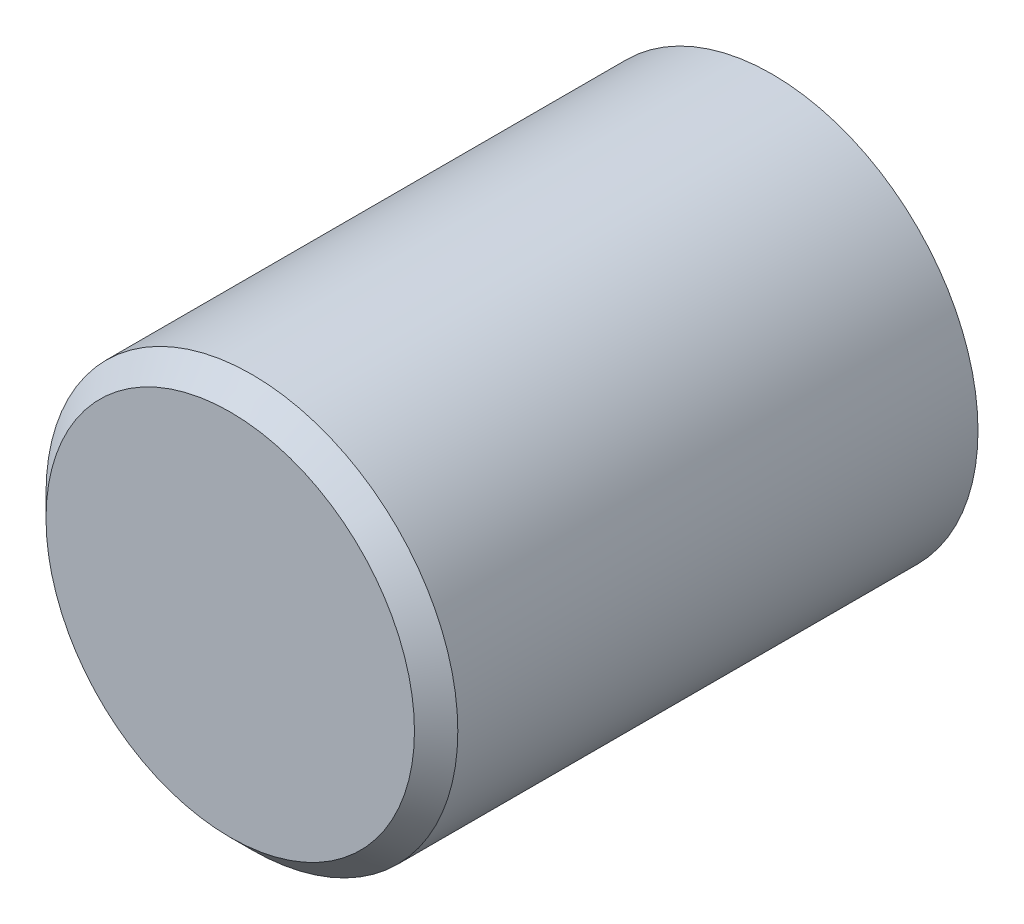
ISO-10303-21;
HEADER;
FILE_DESCRIPTION(('STEP AP214'),'2;1');
FILE_NAME('part.step','',(''),(''),'','','');
FILE_SCHEMA(('AUTOMOTIVE_DESIGN { 1 0 10303 214 1 1 1 1 }'));
ENDSEC;
DATA;
#1=APPLICATION_CONTEXT('core data for automotive mechanical design processes');
#2=APPLICATION_PROTOCOL_DEFINITION('international standard','automotive_design',2000,#1);
#3=PRODUCT_CONTEXT('',#1,'mechanical');
#4=PRODUCT('Part','Part','',(#3));
#5=PRODUCT_RELATED_PRODUCT_CATEGORY('part','',(#4));
#6=PRODUCT_DEFINITION_FORMATION('','',#4);
#7=PRODUCT_DEFINITION_CONTEXT('part definition',#1,'design');
#8=PRODUCT_DEFINITION('design','',#6,#7);
#9=PRODUCT_DEFINITION_SHAPE('','',#8);
#10=(LENGTH_UNIT() NAMED_UNIT(*) SI_UNIT(.MILLI.,.METRE.));
#11=(NAMED_UNIT(*) PLANE_ANGLE_UNIT() SI_UNIT($,.RADIAN.));
#12=(NAMED_UNIT(*) SI_UNIT($,.STERADIAN.) SOLID_ANGLE_UNIT());
#13=UNCERTAINTY_MEASURE_WITH_UNIT(LENGTH_MEASURE(1.E-05),#10,'distance_accuracy_value','');
#14=(GEOMETRIC_REPRESENTATION_CONTEXT(3) GLOBAL_UNCERTAINTY_ASSIGNED_CONTEXT((#13)) GLOBAL_UNIT_ASSIGNED_CONTEXT((#10,
#11,#12)) REPRESENTATION_CONTEXT('',''));
#15=CARTESIAN_POINT('',(0.,0.,0.));
#16=DIRECTION('',(0.,0.,1.));
#17=DIRECTION('',(1.,0.,0.));
#18=AXIS2_PLACEMENT_3D('',#15,#16,#17);
#19=CARTESIAN_POINT('',(0.,0.,-50.));
#20=DIRECTION('',(0.,0.,1.));
#21=DIRECTION('',(1.,0.,0.));
#22=AXIS2_PLACEMENT_3D('',#19,#20,#21);
#23=CYLINDRICAL_SURFACE('',#22,19.);
#24=CARTESIAN_POINT('',(0.,0.,-2.00000000000002));
#25=DIRECTION('',(0.,0.,1.));
#26=DIRECTION('',(1.,0.,0.));
#27=AXIS2_PLACEMENT_3D('',#24,#25,#26);
#28=CIRCLE('',#27,19.);
#29=CARTESIAN_POINT('',(19.,0.,-2.00000000000002));
#30=VERTEX_POINT('',#29);
#31=EDGE_CURVE('E10',#30,#30,#28,.F.);
#32=ORIENTED_EDGE('',*,*,#31,.T.);
#33=EDGE_LOOP('',(#32));
#34=FACE_BOUND('',#33,.T.);
#35=CARTESIAN_POINT('',(0.,0.,-50.));
#36=DIRECTION('',(0.,0.,1.));
#37=DIRECTION('',(1.,0.,0.));
#38=AXIS2_PLACEMENT_3D('',#35,#36,#37);
#39=CIRCLE('',#38,19.);
#40=CARTESIAN_POINT('',(19.,0.,-50.));
#41=VERTEX_POINT('',#40);
#42=EDGE_CURVE('E42',#41,#41,#39,.T.);
#43=ORIENTED_EDGE('',*,*,#42,.T.);
#44=EDGE_LOOP('',(#43));
#45=FACE_BOUND('',#44,.T.);
#46=ADVANCED_FACE('F31',(#34,#45),#23,.T.);
#47=CARTESIAN_POINT('',(0.,0.,-50.));
#48=DIRECTION('',(0.,0.,1.));
#49=DIRECTION('',(1.,0.,0.));
#50=AXIS2_PLACEMENT_3D('',#47,#48,#49);
#51=PLANE('',#50);
#52=CARTESIAN_POINT('',(0.,0.,-50.));
#53=DIRECTION('',(0.,0.,-1.));
#54=DIRECTION('',(-1.,0.,0.));
#55=AXIS2_PLACEMENT_3D('',#52,#53,#54);
#56=CIRCLE('',#55,8.);
#57=CARTESIAN_POINT('',(-8.,0.,-50.));
#58=VERTEX_POINT('',#57);
#59=EDGE_CURVE('E49',#58,#58,#56,.T.);
#60=ORIENTED_EDGE('',*,*,#59,.F.);
#61=EDGE_LOOP('',(#60));
#62=FACE_BOUND('',#61,.T.);
#63=ORIENTED_EDGE('',*,*,#42,.F.);
#64=EDGE_LOOP('',(#63));
#65=FACE_BOUND('',#64,.T.);
#66=ADVANCED_FACE('F63',(#62,#65),#51,.F.);
#67=CARTESIAN_POINT('',(0.,0.,0.));
#68=DIRECTION('',(0.,0.,1.));
#69=DIRECTION('',(1.,0.,0.));
#70=AXIS2_PLACEMENT_3D('',#67,#68,#69);
#71=PLANE('',#70);
#72=CARTESIAN_POINT('',(0.,0.,0.));
#73=DIRECTION('',(0.,0.,1.));
#74=DIRECTION('',(1.,0.,0.));
#75=AXIS2_PLACEMENT_3D('',#72,#73,#74);
#76=CIRCLE('',#75,17.);
#77=CARTESIAN_POINT('',(17.,0.,0.));
#78=VERTEX_POINT('',#77);
#79=EDGE_CURVE('E38',#78,#78,#76,.T.);
#80=ORIENTED_EDGE('',*,*,#79,.T.);
#81=EDGE_LOOP('',(#80));
#82=FACE_BOUND('',#81,.T.);
#83=ADVANCED_FACE('F66',(#82),#71,.T.);
#84=CARTESIAN_POINT('',(0.,0.,0.));
#85=DIRECTION('',(0.,0.,-1.));
#86=DIRECTION('',(-1.,0.,0.));
#87=AXIS2_PLACEMENT_3D('',#84,#85,#86);
#88=CONICAL_SURFACE('',#87,17.,0.785398163397447);
#89=ORIENTED_EDGE('',*,*,#31,.F.);
#90=EDGE_LOOP('',(#89));
#91=FACE_BOUND('',#90,.T.);
#92=ORIENTED_EDGE('',*,*,#79,.F.);
#93=EDGE_LOOP('',(#92));
#94=FACE_BOUND('',#93,.T.);
#95=ADVANCED_FACE('F33',(#91,#94),#88,.T.);
#96=CARTESIAN_POINT('',(0.,0.,-20.));
#97=DIRECTION('',(0.,0.,-1.));
#98=DIRECTION('',(-1.,0.,0.));
#99=AXIS2_PLACEMENT_3D('',#96,#97,#98);
#100=CYLINDRICAL_SURFACE('',#99,8.);
#101=CARTESIAN_POINT('',(0.,0.,-20.));
#102=DIRECTION('',(0.,0.,-1.));
#103=DIRECTION('',(-1.,0.,0.));
#104=AXIS2_PLACEMENT_3D('',#101,#102,#103);
#105=CIRCLE('',#104,8.);
#106=CARTESIAN_POINT('',(-8.,0.,-20.));
#107=VERTEX_POINT('',#106);
#108=EDGE_CURVE('E46',#107,#107,#105,.T.);
#109=ORIENTED_EDGE('',*,*,#108,.F.);
#110=EDGE_LOOP('',(#109));
#111=FACE_BOUND('',#110,.T.);
#112=ORIENTED_EDGE('',*,*,#59,.T.);
#113=EDGE_LOOP('',(#112));
#114=FACE_BOUND('',#113,.T.);
#115=ADVANCED_FACE('F57',(#111,#114),#100,.F.);
#116=CARTESIAN_POINT('',(0.,0.,-20.));
#117=DIRECTION('',(0.,0.,-1.));
#118=DIRECTION('',(-1.,0.,0.));
#119=AXIS2_PLACEMENT_3D('',#116,#117,#118);
#120=PLANE('',#119);
#121=ORIENTED_EDGE('',*,*,#108,.T.);
#122=EDGE_LOOP('',(#121));
#123=FACE_BOUND('',#122,.T.);
#124=ADVANCED_FACE('F55',(#123),#120,.T.);
#125=CLOSED_SHELL('',(#46,#66,#83,#95,#115,#124));
#126=MANIFOLD_SOLID_BREP('B2',#125);
#127=ADVANCED_BREP_SHAPE_REPRESENTATION('',(#18,#126),#14);
#128=SHAPE_DEFINITION_REPRESENTATION(#9,#127);
ENDSEC;
END-ISO-10303-21;
